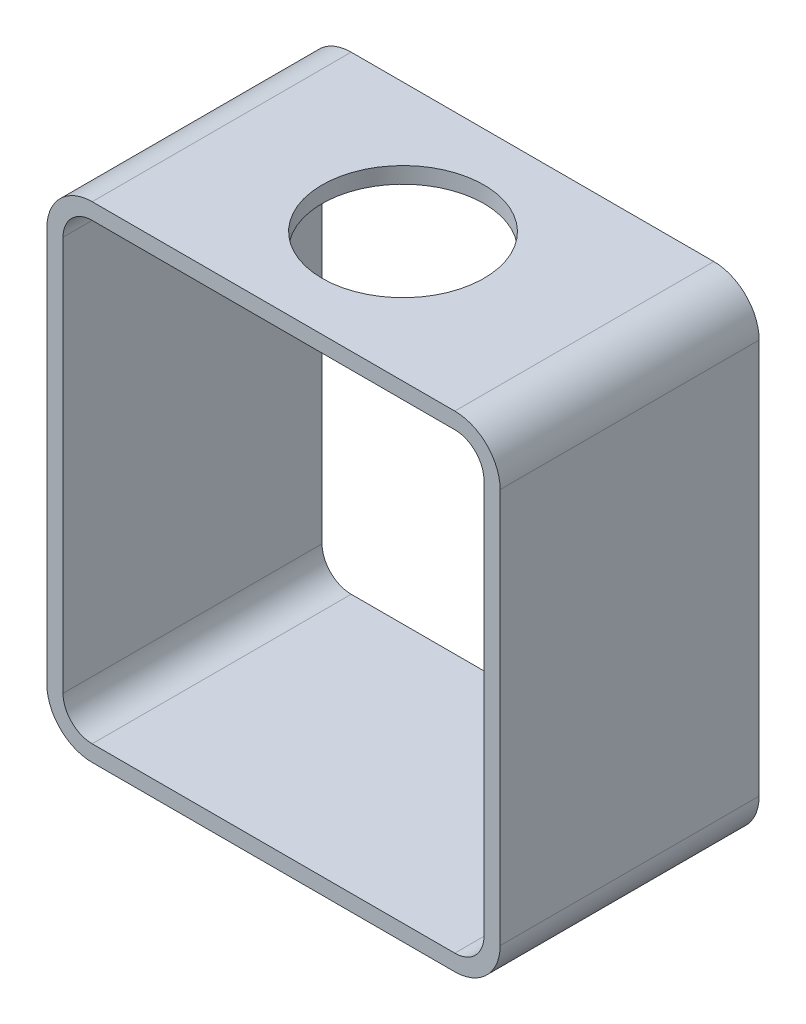
ISO-10303-21;
HEADER;
FILE_DESCRIPTION(('STEP AP214'),'2;1');
FILE_NAME('part.step','',(''),(''),'','','');
FILE_SCHEMA(('AUTOMOTIVE_DESIGN { 1 0 10303 214 1 1 1 1 }'));
ENDSEC;
DATA;
#1=APPLICATION_CONTEXT('core data for automotive mechanical design processes');
#2=APPLICATION_PROTOCOL_DEFINITION('international standard','automotive_design',2000,#1);
#3=PRODUCT_CONTEXT('',#1,'mechanical');
#4=PRODUCT('Part','Part','',(#3));
#5=PRODUCT_RELATED_PRODUCT_CATEGORY('part','',(#4));
#6=PRODUCT_DEFINITION_FORMATION('','',#4);
#7=PRODUCT_DEFINITION_CONTEXT('part definition',#1,'design');
#8=PRODUCT_DEFINITION('design','',#6,#7);
#9=PRODUCT_DEFINITION_SHAPE('','',#8);
#10=(LENGTH_UNIT() NAMED_UNIT(*) SI_UNIT(.MILLI.,.METRE.));
#11=(NAMED_UNIT(*) PLANE_ANGLE_UNIT() SI_UNIT($,.RADIAN.));
#12=(NAMED_UNIT(*) SI_UNIT($,.STERADIAN.) SOLID_ANGLE_UNIT());
#13=UNCERTAINTY_MEASURE_WITH_UNIT(LENGTH_MEASURE(1.E-05),#10,'distance_accuracy_value','');
#14=(GEOMETRIC_REPRESENTATION_CONTEXT(3) GLOBAL_UNCERTAINTY_ASSIGNED_CONTEXT((#13)) GLOBAL_UNIT_ASSIGNED_CONTEXT((#10,
#11,#12)) REPRESENTATION_CONTEXT('',''));
#15=CARTESIAN_POINT('',(0.,0.,0.));
#16=DIRECTION('',(0.,0.,1.));
#17=DIRECTION('',(1.,0.,0.));
#18=AXIS2_PLACEMENT_3D('',#15,#16,#17);
#19=CARTESIAN_POINT('',(0.,0.,16.));
#20=DIRECTION('',(0.,0.,1.));
#21=DIRECTION('',(1.,0.,0.));
#22=AXIS2_PLACEMENT_3D('',#19,#20,#21);
#23=PLANE('',#22);
#24=DIRECTION('',(1.,0.,0.));
#25=VECTOR('',#24,1.);
#26=CARTESIAN_POINT('',(0.,0.,16.));
#27=LINE('',#26,#25);
#28=CARTESIAN_POINT('',(2.8,0.,16.));
#29=VERTEX_POINT('',#28);
#30=CARTESIAN_POINT('',(25.2,0.,16.));
#31=VERTEX_POINT('',#30);
#32=EDGE_CURVE('E251',#29,#31,#27,.T.);
#33=ORIENTED_EDGE('',*,*,#32,.T.);
#34=CARTESIAN_POINT('',(25.2,2.8,16.));
#35=DIRECTION('',(0.,0.,1.));
#36=DIRECTION('',(1.,0.,0.));
#37=AXIS2_PLACEMENT_3D('',#34,#35,#36);
#38=CIRCLE('',#37,2.8);
#39=CARTESIAN_POINT('',(28.,2.8,16.));
#40=VERTEX_POINT('',#39);
#41=EDGE_CURVE('E232',#31,#40,#38,.T.);
#42=ORIENTED_EDGE('',*,*,#41,.T.);
#43=DIRECTION('',(0.,1.,0.));
#44=VECTOR('',#43,1.);
#45=CARTESIAN_POINT('',(28.,0.,16.));
#46=LINE('',#45,#44);
#47=CARTESIAN_POINT('',(28.,27.2,16.));
#48=VERTEX_POINT('',#47);
#49=EDGE_CURVE('E178',#40,#48,#46,.T.);
#50=ORIENTED_EDGE('',*,*,#49,.T.);
#51=CARTESIAN_POINT('',(25.2,27.2,16.));
#52=DIRECTION('',(0.,0.,1.));
#53=DIRECTION('',(1.,0.,0.));
#54=AXIS2_PLACEMENT_3D('',#51,#52,#53);
#55=CIRCLE('',#54,2.8);
#56=CARTESIAN_POINT('',(25.2,30.,16.));
#57=VERTEX_POINT('',#56);
#58=EDGE_CURVE('E55',#48,#57,#55,.T.);
#59=ORIENTED_EDGE('',*,*,#58,.T.);
#60=DIRECTION('',(-1.,0.,0.));
#61=VECTOR('',#60,1.);
#62=CARTESIAN_POINT('',(28.,30.,16.));
#63=LINE('',#62,#61);
#64=CARTESIAN_POINT('',(2.8,30.,16.));
#65=VERTEX_POINT('',#64);
#66=EDGE_CURVE('E174',#57,#65,#63,.T.);
#67=ORIENTED_EDGE('',*,*,#66,.T.);
#68=CARTESIAN_POINT('',(2.8,27.2,16.));
#69=DIRECTION('',(0.,0.,1.));
#70=DIRECTION('',(1.,0.,0.));
#71=AXIS2_PLACEMENT_3D('',#68,#69,#70);
#72=CIRCLE('',#71,2.8);
#73=CARTESIAN_POINT('',(0.,27.2,16.));
#74=VERTEX_POINT('',#73);
#75=EDGE_CURVE('E228',#65,#74,#72,.T.);
#76=ORIENTED_EDGE('',*,*,#75,.T.);
#77=DIRECTION('',(0.,-1.,0.));
#78=VECTOR('',#77,1.);
#79=CARTESIAN_POINT('',(0.,30.,16.));
#80=LINE('',#79,#78);
#81=CARTESIAN_POINT('',(0.,2.8,16.));
#82=VERTEX_POINT('',#81);
#83=EDGE_CURVE('E248',#74,#82,#80,.T.);
#84=ORIENTED_EDGE('',*,*,#83,.T.);
#85=CARTESIAN_POINT('',(2.8,2.8,16.));
#86=DIRECTION('',(0.,0.,1.));
#87=DIRECTION('',(1.,0.,0.));
#88=AXIS2_PLACEMENT_3D('',#85,#86,#87);
#89=CIRCLE('',#88,2.8);
#90=EDGE_CURVE('E230',#82,#29,#89,.T.);
#91=ORIENTED_EDGE('',*,*,#90,.T.);
#92=EDGE_LOOP('',(#33,#42,#50,#59,#67,#76,#84,#91));
#93=FACE_BOUND('',#92,.T.);
#94=DIRECTION('',(0.,-1.,0.));
#95=VECTOR('',#94,1.);
#96=CARTESIAN_POINT('',(1.,29.,16.));
#97=LINE('',#96,#95);
#98=CARTESIAN_POINT('',(1.,27.2,16.));
#99=VERTEX_POINT('',#98);
#100=CARTESIAN_POINT('',(1.,2.80000000000001,16.));
#101=VERTEX_POINT('',#100);
#102=EDGE_CURVE('E276',#99,#101,#97,.T.);
#103=ORIENTED_EDGE('',*,*,#102,.F.);
#104=CARTESIAN_POINT('',(2.8,27.2,16.));
#105=DIRECTION('',(0.,0.,1.));
#106=DIRECTION('',(1.,0.,0.));
#107=AXIS2_PLACEMENT_3D('',#104,#105,#106);
#108=CIRCLE('',#107,1.8);
#109=CARTESIAN_POINT('',(2.80000000000001,29.,16.));
#110=VERTEX_POINT('',#109);
#111=EDGE_CURVE('E203',#99,#110,#108,.F.);
#112=ORIENTED_EDGE('',*,*,#111,.T.);
#113=DIRECTION('',(-1.,0.,0.));
#114=VECTOR('',#113,1.);
#115=CARTESIAN_POINT('',(27.,29.,16.));
#116=LINE('',#115,#114);
#117=CARTESIAN_POINT('',(25.2,29.,16.));
#118=VERTEX_POINT('',#117);
#119=EDGE_CURVE('E266',#118,#110,#116,.T.);
#120=ORIENTED_EDGE('',*,*,#119,.F.);
#121=CARTESIAN_POINT('',(25.2,27.2,16.));
#122=DIRECTION('',(0.,0.,1.));
#123=DIRECTION('',(1.,0.,0.));
#124=AXIS2_PLACEMENT_3D('',#121,#122,#123);
#125=CIRCLE('',#124,1.8);
#126=CARTESIAN_POINT('',(27.,27.2,16.));
#127=VERTEX_POINT('',#126);
#128=EDGE_CURVE('E207',#118,#127,#125,.F.);
#129=ORIENTED_EDGE('',*,*,#128,.T.);
#130=DIRECTION('',(0.,1.,0.));
#131=VECTOR('',#130,1.);
#132=CARTESIAN_POINT('',(27.,1.,16.));
#133=LINE('',#132,#131);
#134=CARTESIAN_POINT('',(27.,2.8,16.));
#135=VERTEX_POINT('',#134);
#136=EDGE_CURVE('E261',#135,#127,#133,.T.);
#137=ORIENTED_EDGE('',*,*,#136,.F.);
#138=CARTESIAN_POINT('',(25.2,2.8,16.));
#139=DIRECTION('',(0.,0.,1.));
#140=DIRECTION('',(1.,0.,0.));
#141=AXIS2_PLACEMENT_3D('',#138,#139,#140);
#142=CIRCLE('',#141,1.8);
#143=CARTESIAN_POINT('',(25.2,1.,16.));
#144=VERTEX_POINT('',#143);
#145=EDGE_CURVE('E160',#135,#144,#142,.F.);
#146=ORIENTED_EDGE('',*,*,#145,.T.);
#147=DIRECTION('',(1.,0.,0.));
#148=VECTOR('',#147,1.);
#149=CARTESIAN_POINT('',(1.,1.,16.));
#150=LINE('',#149,#148);
#151=CARTESIAN_POINT('',(2.8,1.,16.));
#152=VERTEX_POINT('',#151);
#153=EDGE_CURVE('E274',#152,#144,#150,.T.);
#154=ORIENTED_EDGE('',*,*,#153,.F.);
#155=CARTESIAN_POINT('',(2.8,2.8,16.));
#156=DIRECTION('',(0.,0.,1.));
#157=DIRECTION('',(1.,0.,0.));
#158=AXIS2_PLACEMENT_3D('',#155,#156,#157);
#159=CIRCLE('',#158,1.8);
#160=EDGE_CURVE('E159',#152,#101,#159,.F.);
#161=ORIENTED_EDGE('',*,*,#160,.T.);
#162=EDGE_LOOP('',(#103,#112,#120,#129,#137,#146,#154,#161));
#163=FACE_BOUND('',#162,.T.);
#164=ADVANCED_FACE('F34',(#93,#163),#23,.T.);
#165=CARTESIAN_POINT('',(0.,0.,0.));
#166=DIRECTION('',(0.,0.,1.));
#167=DIRECTION('',(1.,0.,0.));
#168=AXIS2_PLACEMENT_3D('',#165,#166,#167);
#169=PLANE('',#168);
#170=DIRECTION('',(0.,1.,0.));
#171=VECTOR('',#170,1.);
#172=CARTESIAN_POINT('',(28.,0.,0.));
#173=LINE('',#172,#171);
#174=CARTESIAN_POINT('',(28.,2.8,0.));
#175=VERTEX_POINT('',#174);
#176=CARTESIAN_POINT('',(28.,27.2,0.));
#177=VERTEX_POINT('',#176);
#178=EDGE_CURVE('E249',#175,#177,#173,.T.);
#179=ORIENTED_EDGE('',*,*,#178,.F.);
#180=CARTESIAN_POINT('',(25.2,2.8,0.));
#181=DIRECTION('',(0.,0.,1.));
#182=DIRECTION('',(1.,0.,0.));
#183=AXIS2_PLACEMENT_3D('',#180,#181,#182);
#184=CIRCLE('',#183,2.8);
#185=CARTESIAN_POINT('',(25.2,0.,0.));
#186=VERTEX_POINT('',#185);
#187=EDGE_CURVE('E220',#175,#186,#184,.F.);
#188=ORIENTED_EDGE('',*,*,#187,.T.);
#189=DIRECTION('',(1.,0.,0.));
#190=VECTOR('',#189,1.);
#191=CARTESIAN_POINT('',(0.,0.,0.));
#192=LINE('',#191,#190);
#193=CARTESIAN_POINT('',(2.8,0.,0.));
#194=VERTEX_POINT('',#193);
#195=EDGE_CURVE('E253',#194,#186,#192,.T.);
#196=ORIENTED_EDGE('',*,*,#195,.F.);
#197=CARTESIAN_POINT('',(2.8,2.8,0.));
#198=DIRECTION('',(0.,0.,1.));
#199=DIRECTION('',(1.,0.,0.));
#200=AXIS2_PLACEMENT_3D('',#197,#198,#199);
#201=CIRCLE('',#200,2.8);
#202=CARTESIAN_POINT('',(0.,2.8,0.));
#203=VERTEX_POINT('',#202);
#204=EDGE_CURVE('E218',#194,#203,#201,.F.);
#205=ORIENTED_EDGE('',*,*,#204,.T.);
#206=DIRECTION('',(0.,-1.,0.));
#207=VECTOR('',#206,1.);
#208=CARTESIAN_POINT('',(0.,30.,0.));
#209=LINE('',#208,#207);
#210=CARTESIAN_POINT('',(0.,27.2,0.));
#211=VERTEX_POINT('',#210);
#212=EDGE_CURVE('E257',#211,#203,#209,.T.);
#213=ORIENTED_EDGE('',*,*,#212,.F.);
#214=CARTESIAN_POINT('',(2.8,27.2,0.));
#215=DIRECTION('',(0.,0.,1.));
#216=DIRECTION('',(1.,0.,0.));
#217=AXIS2_PLACEMENT_3D('',#214,#215,#216);
#218=CIRCLE('',#217,2.8);
#219=CARTESIAN_POINT('',(2.8,30.,0.));
#220=VERTEX_POINT('',#219);
#221=EDGE_CURVE('E216',#211,#220,#218,.F.);
#222=ORIENTED_EDGE('',*,*,#221,.T.);
#223=DIRECTION('',(-1.,0.,0.));
#224=VECTOR('',#223,1.);
#225=CARTESIAN_POINT('',(28.,30.,0.));
#226=LINE('',#225,#224);
#227=CARTESIAN_POINT('',(25.2,30.,0.));
#228=VERTEX_POINT('',#227);
#229=EDGE_CURVE('E181',#228,#220,#226,.T.);
#230=ORIENTED_EDGE('',*,*,#229,.F.);
#231=CARTESIAN_POINT('',(25.2,27.2,0.));
#232=DIRECTION('',(0.,0.,1.));
#233=DIRECTION('',(1.,0.,0.));
#234=AXIS2_PLACEMENT_3D('',#231,#232,#233);
#235=CIRCLE('',#234,2.8);
#236=EDGE_CURVE('E214',#228,#177,#235,.F.);
#237=ORIENTED_EDGE('',*,*,#236,.T.);
#238=EDGE_LOOP('',(#179,#188,#196,#205,#213,#222,#230,#237));
#239=FACE_BOUND('',#238,.T.);
#240=DIRECTION('',(0.,1.,0.));
#241=VECTOR('',#240,1.);
#242=CARTESIAN_POINT('',(27.,1.,0.));
#243=LINE('',#242,#241);
#244=CARTESIAN_POINT('',(27.,2.8,0.));
#245=VERTEX_POINT('',#244);
#246=CARTESIAN_POINT('',(27.,27.2,0.));
#247=VERTEX_POINT('',#246);
#248=EDGE_CURVE('E170',#245,#247,#243,.T.);
#249=ORIENTED_EDGE('',*,*,#248,.T.);
#250=CARTESIAN_POINT('',(25.2,27.2,0.));
#251=DIRECTION('',(0.,0.,1.));
#252=DIRECTION('',(1.,0.,0.));
#253=AXIS2_PLACEMENT_3D('',#250,#251,#252);
#254=CIRCLE('',#253,1.8);
#255=CARTESIAN_POINT('',(25.2,29.,0.));
#256=VERTEX_POINT('',#255);
#257=EDGE_CURVE('E205',#247,#256,#254,.T.);
#258=ORIENTED_EDGE('',*,*,#257,.T.);
#259=DIRECTION('',(-1.,0.,0.));
#260=VECTOR('',#259,1.);
#261=CARTESIAN_POINT('',(27.,29.,0.));
#262=LINE('',#261,#260);
#263=CARTESIAN_POINT('',(2.80000000000001,29.,0.));
#264=VERTEX_POINT('',#263);
#265=EDGE_CURVE('E269',#256,#264,#262,.T.);
#266=ORIENTED_EDGE('',*,*,#265,.T.);
#267=CARTESIAN_POINT('',(2.8,27.2,0.));
#268=DIRECTION('',(0.,0.,1.));
#269=DIRECTION('',(1.,0.,0.));
#270=AXIS2_PLACEMENT_3D('',#267,#268,#269);
#271=CIRCLE('',#270,1.8);
#272=CARTESIAN_POINT('',(1.,27.2,0.));
#273=VERTEX_POINT('',#272);
#274=EDGE_CURVE('E201',#264,#273,#271,.T.);
#275=ORIENTED_EDGE('',*,*,#274,.T.);
#276=DIRECTION('',(0.,-1.,0.));
#277=VECTOR('',#276,1.);
#278=CARTESIAN_POINT('',(1.,29.,0.));
#279=LINE('',#278,#277);
#280=CARTESIAN_POINT('',(1.,2.80000000000001,0.));
#281=VERTEX_POINT('',#280);
#282=EDGE_CURVE('E154',#273,#281,#279,.T.);
#283=ORIENTED_EDGE('',*,*,#282,.T.);
#284=CARTESIAN_POINT('',(2.8,2.8,0.));
#285=DIRECTION('',(0.,0.,1.));
#286=DIRECTION('',(1.,0.,0.));
#287=AXIS2_PLACEMENT_3D('',#284,#285,#286);
#288=CIRCLE('',#287,1.8);
#289=CARTESIAN_POINT('',(2.8,1.,0.));
#290=VERTEX_POINT('',#289);
#291=EDGE_CURVE('E148',#281,#290,#288,.T.);
#292=ORIENTED_EDGE('',*,*,#291,.T.);
#293=DIRECTION('',(1.,0.,0.));
#294=VECTOR('',#293,1.);
#295=CARTESIAN_POINT('',(1.,1.,0.));
#296=LINE('',#295,#294);
#297=CARTESIAN_POINT('',(25.2,1.,0.));
#298=VERTEX_POINT('',#297);
#299=EDGE_CURVE('E152',#290,#298,#296,.T.);
#300=ORIENTED_EDGE('',*,*,#299,.T.);
#301=CARTESIAN_POINT('',(25.2,2.8,0.));
#302=DIRECTION('',(0.,0.,1.));
#303=DIRECTION('',(1.,0.,0.));
#304=AXIS2_PLACEMENT_3D('',#301,#302,#303);
#305=CIRCLE('',#304,1.8);
#306=EDGE_CURVE('E197',#298,#245,#305,.T.);
#307=ORIENTED_EDGE('',*,*,#306,.T.);
#308=EDGE_LOOP('',(#249,#258,#266,#275,#283,#292,#300,#307));
#309=FACE_BOUND('',#308,.T.);
#310=ADVANCED_FACE('F151',(#239,#309),#169,.F.);
#311=CARTESIAN_POINT('',(0.,30.,16.));
#312=DIRECTION('',(1.,0.,0.));
#313=DIRECTION('',(0.,0.,-1.));
#314=AXIS2_PLACEMENT_3D('',#311,#312,#313);
#315=PLANE('',#314);
#316=ORIENTED_EDGE('',*,*,#212,.T.);
#317=DIRECTION('',(0.,0.,-1.));
#318=VECTOR('',#317,1.);
#319=CARTESIAN_POINT('',(0.,2.8,16.));
#320=LINE('',#319,#318);
#321=EDGE_CURVE('E237',#203,#82,#320,.F.);
#322=ORIENTED_EDGE('',*,*,#321,.T.);
#323=ORIENTED_EDGE('',*,*,#83,.F.);
#324=DIRECTION('',(0.,0.,-1.));
#325=VECTOR('',#324,1.);
#326=CARTESIAN_POINT('',(0.,27.2,16.));
#327=LINE('',#326,#325);
#328=EDGE_CURVE('E234',#74,#211,#327,.T.);
#329=ORIENTED_EDGE('',*,*,#328,.T.);
#330=EDGE_LOOP('',(#316,#322,#323,#329));
#331=FACE_BOUND('',#330,.T.);
#332=ADVANCED_FACE('F334',(#331),#315,.F.);
#333=CARTESIAN_POINT('',(0.,0.,16.));
#334=DIRECTION('',(0.,1.,0.));
#335=DIRECTION('',(0.,0.,1.));
#336=AXIS2_PLACEMENT_3D('',#333,#334,#335);
#337=PLANE('',#336);
#338=ORIENTED_EDGE('',*,*,#195,.T.);
#339=DIRECTION('',(0.,0.,-1.));
#340=VECTOR('',#339,1.);
#341=CARTESIAN_POINT('',(25.2,0.,16.));
#342=LINE('',#341,#340);
#343=EDGE_CURVE('E225',#186,#31,#342,.F.);
#344=ORIENTED_EDGE('',*,*,#343,.T.);
#345=ORIENTED_EDGE('',*,*,#32,.F.);
#346=DIRECTION('',(0.,0.,-1.));
#347=VECTOR('',#346,1.);
#348=CARTESIAN_POINT('',(2.8,0.,16.));
#349=LINE('',#348,#347);
#350=EDGE_CURVE('E222',#29,#194,#349,.T.);
#351=ORIENTED_EDGE('',*,*,#350,.T.);
#352=EDGE_LOOP('',(#338,#344,#345,#351));
#353=FACE_BOUND('',#352,.T.);
#354=ADVANCED_FACE('F344',(#353),#337,.F.);
#355=CARTESIAN_POINT('',(28.,0.,16.));
#356=DIRECTION('',(-1.,0.,0.));
#357=DIRECTION('',(0.,0.,1.));
#358=AXIS2_PLACEMENT_3D('',#355,#356,#357);
#359=PLANE('',#358);
#360=ORIENTED_EDGE('',*,*,#49,.F.);
#361=DIRECTION('',(0.,0.,-1.));
#362=VECTOR('',#361,1.);
#363=CARTESIAN_POINT('',(28.,2.8,16.));
#364=LINE('',#363,#362);
#365=EDGE_CURVE('E211',#40,#175,#364,.T.);
#366=ORIENTED_EDGE('',*,*,#365,.T.);
#367=ORIENTED_EDGE('',*,*,#178,.T.);
#368=DIRECTION('',(0.,0.,-1.));
#369=VECTOR('',#368,1.);
#370=CARTESIAN_POINT('',(28.,27.2,16.));
#371=LINE('',#370,#369);
#372=EDGE_CURVE('E209',#177,#48,#371,.F.);
#373=ORIENTED_EDGE('',*,*,#372,.T.);
#374=EDGE_LOOP('',(#360,#366,#367,#373));
#375=FACE_BOUND('',#374,.T.);
#376=ADVANCED_FACE('F340',(#375),#359,.F.);
#377=CARTESIAN_POINT('',(28.,30.,16.));
#378=DIRECTION('',(0.,-1.,0.));
#379=DIRECTION('',(0.,0.,-1.));
#380=AXIS2_PLACEMENT_3D('',#377,#378,#379);
#381=PLANE('',#380);
#382=CARTESIAN_POINT('',(14.,30.,8.));
#383=DIRECTION('',(0.,1.,0.));
#384=DIRECTION('',(0.,0.,1.));
#385=AXIS2_PLACEMENT_3D('',#382,#383,#384);
#386=CIRCLE('',#385,5.);
#387=CARTESIAN_POINT('',(14.,30.,13.));
#388=VERTEX_POINT('',#387);
#389=EDGE_CURVE('E281',#388,#388,#386,.T.);
#390=ORIENTED_EDGE('',*,*,#389,.F.);
#391=EDGE_LOOP('',(#390));
#392=FACE_BOUND('',#391,.T.);
#393=ORIENTED_EDGE('',*,*,#229,.T.);
#394=DIRECTION('',(0.,0.,-1.));
#395=VECTOR('',#394,1.);
#396=CARTESIAN_POINT('',(2.8,30.,16.));
#397=LINE('',#396,#395);
#398=EDGE_CURVE('E11',#220,#65,#397,.F.);
#399=ORIENTED_EDGE('',*,*,#398,.T.);
#400=ORIENTED_EDGE('',*,*,#66,.F.);
#401=DIRECTION('',(0.,0.,-1.));
#402=VECTOR('',#401,1.);
#403=CARTESIAN_POINT('',(25.2,30.,16.));
#404=LINE('',#403,#402);
#405=EDGE_CURVE('E43',#57,#228,#404,.T.);
#406=ORIENTED_EDGE('',*,*,#405,.T.);
#407=EDGE_LOOP('',(#393,#399,#400,#406));
#408=FACE_BOUND('',#407,.T.);
#409=ADVANCED_FACE('F242',(#392,#408),#381,.F.);
#410=CARTESIAN_POINT('',(27.,29.,16.));
#411=DIRECTION('',(0.,-1.,0.));
#412=DIRECTION('',(0.,0.,-1.));
#413=AXIS2_PLACEMENT_3D('',#410,#411,#412);
#414=PLANE('',#413);
#415=CARTESIAN_POINT('',(14.,29.,8.));
#416=DIRECTION('',(0.,-1.,0.));
#417=DIRECTION('',(0.,0.,-1.));
#418=AXIS2_PLACEMENT_3D('',#415,#416,#417);
#419=CIRCLE('',#418,5.);
#420=CARTESIAN_POINT('',(14.,29.,3.));
#421=VERTEX_POINT('',#420);
#422=EDGE_CURVE('E38',#421,#421,#419,.T.);
#423=ORIENTED_EDGE('',*,*,#422,.F.);
#424=EDGE_LOOP('',(#423));
#425=FACE_BOUND('',#424,.T.);
#426=ORIENTED_EDGE('',*,*,#119,.T.);
#427=DIRECTION('',(0.,0.,-1.));
#428=VECTOR('',#427,1.);
#429=CARTESIAN_POINT('',(2.8,29.,0.));
#430=LINE('',#429,#428);
#431=EDGE_CURVE('E194',#110,#264,#430,.T.);
#432=ORIENTED_EDGE('',*,*,#431,.T.);
#433=ORIENTED_EDGE('',*,*,#265,.F.);
#434=DIRECTION('',(0.,0.,-1.));
#435=VECTOR('',#434,1.);
#436=CARTESIAN_POINT('',(25.2,29.,16.));
#437=LINE('',#436,#435);
#438=EDGE_CURVE('E192',#256,#118,#437,.F.);
#439=ORIENTED_EDGE('',*,*,#438,.T.);
#440=EDGE_LOOP('',(#426,#432,#433,#439));
#441=FACE_BOUND('',#440,.T.);
#442=ADVANCED_FACE('F290',(#425,#441),#414,.T.);
#443=CARTESIAN_POINT('',(1.,29.,16.));
#444=DIRECTION('',(1.,0.,0.));
#445=DIRECTION('',(0.,0.,-1.));
#446=AXIS2_PLACEMENT_3D('',#443,#444,#445);
#447=PLANE('',#446);
#448=ORIENTED_EDGE('',*,*,#102,.T.);
#449=DIRECTION('',(0.,0.,-1.));
#450=VECTOR('',#449,1.);
#451=CARTESIAN_POINT('',(1.,2.8,0.));
#452=LINE('',#451,#450);
#453=EDGE_CURVE('E190',#101,#281,#452,.T.);
#454=ORIENTED_EDGE('',*,*,#453,.T.);
#455=ORIENTED_EDGE('',*,*,#282,.F.);
#456=DIRECTION('',(0.,0.,-1.));
#457=VECTOR('',#456,1.);
#458=CARTESIAN_POINT('',(1.,27.2,16.));
#459=LINE('',#458,#457);
#460=EDGE_CURVE('E188',#273,#99,#459,.F.);
#461=ORIENTED_EDGE('',*,*,#460,.T.);
#462=EDGE_LOOP('',(#448,#454,#455,#461));
#463=FACE_BOUND('',#462,.T.);
#464=ADVANCED_FACE('F293',(#463),#447,.T.);
#465=CARTESIAN_POINT('',(1.,1.,16.));
#466=DIRECTION('',(0.,1.,0.));
#467=DIRECTION('',(0.,0.,1.));
#468=AXIS2_PLACEMENT_3D('',#465,#466,#467);
#469=PLANE('',#468);
#470=ORIENTED_EDGE('',*,*,#153,.T.);
#471=DIRECTION('',(0.,0.,-1.));
#472=VECTOR('',#471,1.);
#473=CARTESIAN_POINT('',(25.2,1.,0.));
#474=LINE('',#473,#472);
#475=EDGE_CURVE('E169',#144,#298,#474,.T.);
#476=ORIENTED_EDGE('',*,*,#475,.T.);
#477=ORIENTED_EDGE('',*,*,#299,.F.);
#478=DIRECTION('',(0.,0.,-1.));
#479=VECTOR('',#478,1.);
#480=CARTESIAN_POINT('',(2.8,1.,16.));
#481=LINE('',#480,#479);
#482=EDGE_CURVE('E166',#290,#152,#481,.F.);
#483=ORIENTED_EDGE('',*,*,#482,.T.);
#484=EDGE_LOOP('',(#470,#476,#477,#483));
#485=FACE_BOUND('',#484,.T.);
#486=ADVANCED_FACE('F165',(#485),#469,.T.);
#487=CARTESIAN_POINT('',(27.,1.,16.));
#488=DIRECTION('',(-1.,0.,0.));
#489=DIRECTION('',(0.,0.,1.));
#490=AXIS2_PLACEMENT_3D('',#487,#488,#489);
#491=PLANE('',#490);
#492=ORIENTED_EDGE('',*,*,#248,.F.);
#493=DIRECTION('',(0.,0.,-1.));
#494=VECTOR('',#493,1.);
#495=CARTESIAN_POINT('',(27.,2.8,16.));
#496=LINE('',#495,#494);
#497=EDGE_CURVE('E186',#245,#135,#496,.F.);
#498=ORIENTED_EDGE('',*,*,#497,.T.);
#499=ORIENTED_EDGE('',*,*,#136,.T.);
#500=DIRECTION('',(0.,0.,-1.));
#501=VECTOR('',#500,1.);
#502=CARTESIAN_POINT('',(27.,27.2,0.));
#503=LINE('',#502,#501);
#504=EDGE_CURVE('E176',#127,#247,#503,.T.);
#505=ORIENTED_EDGE('',*,*,#504,.T.);
#506=EDGE_LOOP('',(#492,#498,#499,#505));
#507=FACE_BOUND('',#506,.T.);
#508=ADVANCED_FACE('F314',(#507),#491,.T.);
#509=CARTESIAN_POINT('',(25.2,2.8,16.));
#510=DIRECTION('',(0.,0.,1.));
#511=DIRECTION('',(1.,0.,0.));
#512=AXIS2_PLACEMENT_3D('',#509,#510,#511);
#513=CYLINDRICAL_SURFACE('',#512,1.8);
#514=ORIENTED_EDGE('',*,*,#145,.F.);
#515=ORIENTED_EDGE('',*,*,#497,.F.);
#516=ORIENTED_EDGE('',*,*,#306,.F.);
#517=ORIENTED_EDGE('',*,*,#475,.F.);
#518=EDGE_LOOP('',(#514,#515,#516,#517));
#519=FACE_BOUND('',#518,.T.);
#520=ADVANCED_FACE('F310',(#519),#513,.F.);
#521=CARTESIAN_POINT('',(2.8,2.8,16.));
#522=DIRECTION('',(0.,0.,1.));
#523=DIRECTION('',(1.,0.,0.));
#524=AXIS2_PLACEMENT_3D('',#521,#522,#523);
#525=CYLINDRICAL_SURFACE('',#524,1.8);
#526=ORIENTED_EDGE('',*,*,#160,.F.);
#527=ORIENTED_EDGE('',*,*,#482,.F.);
#528=ORIENTED_EDGE('',*,*,#291,.F.);
#529=ORIENTED_EDGE('',*,*,#453,.F.);
#530=EDGE_LOOP('',(#526,#527,#528,#529));
#531=FACE_BOUND('',#530,.T.);
#532=ADVANCED_FACE('F173',(#531),#525,.F.);
#533=CARTESIAN_POINT('',(2.8,27.2,16.));
#534=DIRECTION('',(0.,0.,1.));
#535=DIRECTION('',(1.,0.,0.));
#536=AXIS2_PLACEMENT_3D('',#533,#534,#535);
#537=CYLINDRICAL_SURFACE('',#536,1.8);
#538=ORIENTED_EDGE('',*,*,#111,.F.);
#539=ORIENTED_EDGE('',*,*,#460,.F.);
#540=ORIENTED_EDGE('',*,*,#274,.F.);
#541=ORIENTED_EDGE('',*,*,#431,.F.);
#542=EDGE_LOOP('',(#538,#539,#540,#541));
#543=FACE_BOUND('',#542,.T.);
#544=ADVANCED_FACE('F303',(#543),#537,.F.);
#545=CARTESIAN_POINT('',(25.2,27.2,16.));
#546=DIRECTION('',(0.,0.,1.));
#547=DIRECTION('',(1.,0.,0.));
#548=AXIS2_PLACEMENT_3D('',#545,#546,#547);
#549=CYLINDRICAL_SURFACE('',#548,1.8);
#550=ORIENTED_EDGE('',*,*,#128,.F.);
#551=ORIENTED_EDGE('',*,*,#438,.F.);
#552=ORIENTED_EDGE('',*,*,#257,.F.);
#553=ORIENTED_EDGE('',*,*,#504,.F.);
#554=EDGE_LOOP('',(#550,#551,#552,#553));
#555=FACE_BOUND('',#554,.T.);
#556=ADVANCED_FACE('F317',(#555),#549,.F.);
#557=CARTESIAN_POINT('',(25.2,2.8,16.));
#558=DIRECTION('',(0.,0.,-1.));
#559=DIRECTION('',(-1.,0.,0.));
#560=AXIS2_PLACEMENT_3D('',#557,#558,#559);
#561=CYLINDRICAL_SURFACE('',#560,2.8);
#562=ORIENTED_EDGE('',*,*,#41,.F.);
#563=ORIENTED_EDGE('',*,*,#343,.F.);
#564=ORIENTED_EDGE('',*,*,#187,.F.);
#565=ORIENTED_EDGE('',*,*,#365,.F.);
#566=EDGE_LOOP('',(#562,#563,#564,#565));
#567=FACE_BOUND('',#566,.T.);
#568=ADVANCED_FACE('F319',(#567),#561,.T.);
#569=CARTESIAN_POINT('',(2.8,2.8,16.));
#570=DIRECTION('',(0.,0.,-1.));
#571=DIRECTION('',(-1.,0.,0.));
#572=AXIS2_PLACEMENT_3D('',#569,#570,#571);
#573=CYLINDRICAL_SURFACE('',#572,2.8);
#574=ORIENTED_EDGE('',*,*,#90,.F.);
#575=ORIENTED_EDGE('',*,*,#321,.F.);
#576=ORIENTED_EDGE('',*,*,#204,.F.);
#577=ORIENTED_EDGE('',*,*,#350,.F.);
#578=EDGE_LOOP('',(#574,#575,#576,#577));
#579=FACE_BOUND('',#578,.T.);
#580=ADVANCED_FACE('F325',(#579),#573,.T.);
#581=CARTESIAN_POINT('',(2.8,27.2,16.));
#582=DIRECTION('',(0.,0.,-1.));
#583=DIRECTION('',(-1.,0.,0.));
#584=AXIS2_PLACEMENT_3D('',#581,#582,#583);
#585=CYLINDRICAL_SURFACE('',#584,2.8);
#586=ORIENTED_EDGE('',*,*,#75,.F.);
#587=ORIENTED_EDGE('',*,*,#398,.F.);
#588=ORIENTED_EDGE('',*,*,#221,.F.);
#589=ORIENTED_EDGE('',*,*,#328,.F.);
#590=EDGE_LOOP('',(#586,#587,#588,#589));
#591=FACE_BOUND('',#590,.T.);
#592=ADVANCED_FACE('F411',(#591),#585,.T.);
#593=CARTESIAN_POINT('',(25.2,27.2,16.));
#594=DIRECTION('',(0.,0.,-1.));
#595=DIRECTION('',(-1.,0.,0.));
#596=AXIS2_PLACEMENT_3D('',#593,#594,#595);
#597=CYLINDRICAL_SURFACE('',#596,2.8);
#598=ORIENTED_EDGE('',*,*,#58,.F.);
#599=ORIENTED_EDGE('',*,*,#372,.F.);
#600=ORIENTED_EDGE('',*,*,#236,.F.);
#601=ORIENTED_EDGE('',*,*,#405,.F.);
#602=EDGE_LOOP('',(#598,#599,#600,#601));
#603=FACE_BOUND('',#602,.T.);
#604=ADVANCED_FACE('F36',(#603),#597,.T.);
#605=CARTESIAN_POINT('',(14.,14.,8.));
#606=DIRECTION('',(0.,1.,0.));
#607=DIRECTION('',(0.,0.,1.));
#608=AXIS2_PLACEMENT_3D('',#605,#606,#607);
#609=CYLINDRICAL_SURFACE('',#608,5.);
#610=ORIENTED_EDGE('',*,*,#422,.T.);
#611=EDGE_LOOP('',(#610));
#612=FACE_BOUND('',#611,.T.);
#613=ORIENTED_EDGE('',*,*,#389,.T.);
#614=EDGE_LOOP('',(#613));
#615=FACE_BOUND('',#614,.T.);
#616=ADVANCED_FACE('F288',(#612,#615),#609,.F.);
#617=CLOSED_SHELL('',(#164,#310,#332,#354,#376,#409,#442,#464,#486,#508,#520,#532,#544,#556,
#568,#580,#592,#604,#616));
#618=MANIFOLD_SOLID_BREP('B2',#617);
#619=ADVANCED_BREP_SHAPE_REPRESENTATION('',(#18,#618),#14);
#620=SHAPE_DEFINITION_REPRESENTATION(#9,#619);
ENDSEC;
END-ISO-10303-21;
